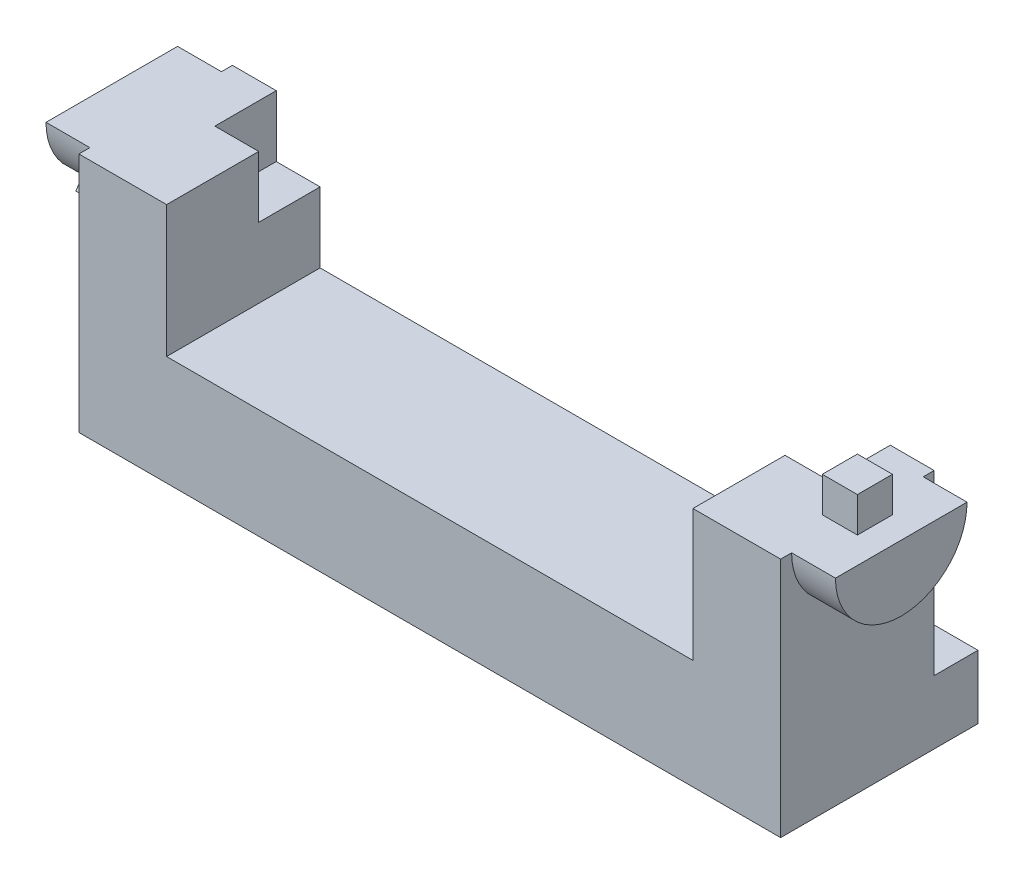
ISO-10303-21;
HEADER;
FILE_DESCRIPTION(('STEP AP214'),'2;1');
FILE_NAME('part.step','',(''),(''),'','','');
FILE_SCHEMA(('AUTOMOTIVE_DESIGN { 1 0 10303 214 1 1 1 1 }'));
ENDSEC;
DATA;
#1=APPLICATION_CONTEXT('core data for automotive mechanical design processes');
#2=APPLICATION_PROTOCOL_DEFINITION('international standard','automotive_design',2000,#1);
#3=PRODUCT_CONTEXT('',#1,'mechanical');
#4=PRODUCT('Part','Part','',(#3));
#5=PRODUCT_RELATED_PRODUCT_CATEGORY('part','',(#4));
#6=PRODUCT_DEFINITION_FORMATION('','',#4);
#7=PRODUCT_DEFINITION_CONTEXT('part definition',#1,'design');
#8=PRODUCT_DEFINITION('design','',#6,#7);
#9=PRODUCT_DEFINITION_SHAPE('','',#8);
#10=(LENGTH_UNIT() NAMED_UNIT(*) SI_UNIT(.MILLI.,.METRE.));
#11=(NAMED_UNIT(*) PLANE_ANGLE_UNIT() SI_UNIT($,.RADIAN.));
#12=(NAMED_UNIT(*) SI_UNIT($,.STERADIAN.) SOLID_ANGLE_UNIT());
#13=UNCERTAINTY_MEASURE_WITH_UNIT(LENGTH_MEASURE(1.E-05),#10,'distance_accuracy_value','');
#14=(GEOMETRIC_REPRESENTATION_CONTEXT(3) GLOBAL_UNCERTAINTY_ASSIGNED_CONTEXT((#13)) GLOBAL_UNIT_ASSIGNED_CONTEXT((#10,
#11,#12)) REPRESENTATION_CONTEXT('',''));
#15=CARTESIAN_POINT('',(0.,0.,0.));
#16=DIRECTION('',(0.,0.,1.));
#17=DIRECTION('',(1.,0.,0.));
#18=AXIS2_PLACEMENT_3D('',#15,#16,#17);
#19=CARTESIAN_POINT('',(0.,13.97,0.));
#20=DIRECTION('',(0.,1.,0.));
#21=DIRECTION('',(0.,0.,1.));
#22=AXIS2_PLACEMENT_3D('',#19,#20,#21);
#23=PLANE('',#22);
#24=DIRECTION('',(-1.,0.,0.));
#25=VECTOR('',#24,1.);
#26=CARTESIAN_POINT('',(38.1,13.97,3.556));
#27=LINE('',#26,#25);
#28=CARTESIAN_POINT('',(38.1,13.97,3.556));
#29=VERTEX_POINT('',#28);
#30=CARTESIAN_POINT('',(35.56,13.97,3.556));
#31=VERTEX_POINT('',#30);
#32=EDGE_CURVE('E385',#29,#31,#27,.T.);
#33=ORIENTED_EDGE('',*,*,#32,.T.);
#34=DIRECTION('',(0.,0.,1.));
#35=VECTOR('',#34,1.);
#36=CARTESIAN_POINT('',(35.56,13.97,8.89));
#37=LINE('',#36,#35);
#38=CARTESIAN_POINT('',(35.56,13.97,8.89));
#39=VERTEX_POINT('',#38);
#40=EDGE_CURVE('E457',#31,#39,#37,.T.);
#41=ORIENTED_EDGE('',*,*,#40,.T.);
#42=DIRECTION('',(1.,0.,0.));
#43=VECTOR('',#42,1.);
#44=CARTESIAN_POINT('',(40.64,13.97,8.89));
#45=LINE('',#44,#43);
#46=CARTESIAN_POINT('',(40.64,13.97,8.89));
#47=VERTEX_POINT('',#46);
#48=EDGE_CURVE('E459',#39,#47,#45,.T.);
#49=ORIENTED_EDGE('',*,*,#48,.T.);
#50=DIRECTION('',(0.,0.,-1.));
#51=VECTOR('',#50,1.);
#52=CARTESIAN_POINT('',(40.64,13.97,8.89));
#53=LINE('',#52,#51);
#54=CARTESIAN_POINT('',(40.64,13.97,8.255));
#55=VERTEX_POINT('',#54);
#56=EDGE_CURVE('E450',#47,#55,#53,.T.);
#57=ORIENTED_EDGE('',*,*,#56,.T.);
#58=DIRECTION('',(-1.,0.,0.));
#59=VECTOR('',#58,1.);
#60=CARTESIAN_POINT('',(43.18,13.97,8.255));
#61=LINE('',#60,#59);
#62=CARTESIAN_POINT('',(43.18,13.97,8.255));
#63=VERTEX_POINT('',#62);
#64=EDGE_CURVE('E361',#63,#55,#61,.T.);
#65=ORIENTED_EDGE('',*,*,#64,.F.);
#66=DIRECTION('',(0.,0.,1.));
#67=VECTOR('',#66,1.);
#68=CARTESIAN_POINT('',(43.18,13.97,0.635));
#69=LINE('',#68,#67);
#70=CARTESIAN_POINT('',(43.18,13.97,0.635));
#71=VERTEX_POINT('',#70);
#72=EDGE_CURVE('E359',#71,#63,#69,.T.);
#73=ORIENTED_EDGE('',*,*,#72,.F.);
#74=DIRECTION('',(-1.,0.,0.));
#75=VECTOR('',#74,1.);
#76=CARTESIAN_POINT('',(43.18,13.97,0.635));
#77=LINE('',#76,#75);
#78=CARTESIAN_POINT('',(40.64,13.97,0.635));
#79=VERTEX_POINT('',#78);
#80=EDGE_CURVE('E366',#71,#79,#77,.T.);
#81=ORIENTED_EDGE('',*,*,#80,.T.);
#82=CARTESIAN_POINT('',(40.64,13.97,0.));
#83=VERTEX_POINT('',#82);
#84=EDGE_CURVE('E454',#79,#83,#53,.T.);
#85=ORIENTED_EDGE('',*,*,#84,.T.);
#86=DIRECTION('',(-1.,0.,0.));
#87=VECTOR('',#86,1.);
#88=CARTESIAN_POINT('',(40.64,13.97,0.));
#89=LINE('',#88,#87);
#90=CARTESIAN_POINT('',(38.1,13.97,0.));
#91=VERTEX_POINT('',#90);
#92=EDGE_CURVE('E453',#83,#91,#89,.T.);
#93=ORIENTED_EDGE('',*,*,#92,.T.);
#94=DIRECTION('',(0.,0.,-1.));
#95=VECTOR('',#94,1.);
#96=CARTESIAN_POINT('',(38.1,13.97,0.));
#97=LINE('',#96,#95);
#98=EDGE_CURVE('E379',#29,#91,#97,.T.);
#99=ORIENTED_EDGE('',*,*,#98,.F.);
#100=EDGE_LOOP('',(#33,#41,#49,#57,#65,#73,#81,#85,#93,#99));
#101=FACE_BOUND('',#100,.T.);
#102=DIRECTION('',(-1.,0.,0.));
#103=VECTOR('',#102,1.);
#104=CARTESIAN_POINT('',(41.656,13.97,3.429));
#105=LINE('',#104,#103);
#106=CARTESIAN_POINT('',(41.656,13.97,3.429));
#107=VERTEX_POINT('',#106);
#108=CARTESIAN_POINT('',(39.624,13.97,3.429));
#109=VERTEX_POINT('',#108);
#110=EDGE_CURVE('E950',#107,#109,#105,.T.);
#111=ORIENTED_EDGE('',*,*,#110,.F.);
#112=DIRECTION('',(0.,0.,-1.));
#113=VECTOR('',#112,1.);
#114=CARTESIAN_POINT('',(41.656,13.97,3.429));
#115=LINE('',#114,#113);
#116=CARTESIAN_POINT('',(41.656,13.97,5.461));
#117=VERTEX_POINT('',#116);
#118=EDGE_CURVE('E285',#117,#107,#115,.T.);
#119=ORIENTED_EDGE('',*,*,#118,.F.);
#120=DIRECTION('',(1.,0.,0.));
#121=VECTOR('',#120,1.);
#122=CARTESIAN_POINT('',(41.656,13.97,5.461));
#123=LINE('',#122,#121);
#124=CARTESIAN_POINT('',(39.624,13.97,5.461));
#125=VERTEX_POINT('',#124);
#126=EDGE_CURVE('E281',#125,#117,#123,.T.);
#127=ORIENTED_EDGE('',*,*,#126,.F.);
#128=DIRECTION('',(0.,0.,1.));
#129=VECTOR('',#128,1.);
#130=CARTESIAN_POINT('',(39.624,13.97,3.429));
#131=LINE('',#130,#129);
#132=EDGE_CURVE('E947',#109,#125,#131,.T.);
#133=ORIENTED_EDGE('',*,*,#132,.F.);
#134=EDGE_LOOP('',(#111,#119,#127,#133));
#135=FACE_BOUND('',#134,.T.);
#136=ADVANCED_FACE('F51',(#101,#135),#23,.T.);
#137=CARTESIAN_POINT('',(0.,6.35,8.89));
#138=DIRECTION('',(0.,-1.,0.));
#139=DIRECTION('',(0.,0.,-1.));
#140=AXIS2_PLACEMENT_3D('',#137,#138,#139);
#141=PLANE('',#140);
#142=DIRECTION('',(0.,0.,1.));
#143=VECTOR('',#142,1.);
#144=CARTESIAN_POINT('',(35.56,6.35,8.89));
#145=LINE('',#144,#143);
#146=CARTESIAN_POINT('',(35.56,6.35,0.));
#147=VERTEX_POINT('',#146);
#148=CARTESIAN_POINT('',(35.56,6.35,8.89));
#149=VERTEX_POINT('',#148);
#150=EDGE_CURVE('E446',#147,#149,#145,.T.);
#151=ORIENTED_EDGE('',*,*,#150,.F.);
#152=DIRECTION('',(-1.,0.,0.));
#153=VECTOR('',#152,1.);
#154=CARTESIAN_POINT('',(0.,6.35,0.));
#155=LINE('',#154,#153);
#156=CARTESIAN_POINT('',(5.08,6.35,0.));
#157=VERTEX_POINT('',#156);
#158=EDGE_CURVE('E493',#147,#157,#155,.T.);
#159=ORIENTED_EDGE('',*,*,#158,.T.);
#160=DIRECTION('',(0.,0.,-1.));
#161=VECTOR('',#160,1.);
#162=CARTESIAN_POINT('',(5.08,6.35,8.89));
#163=LINE('',#162,#161);
#164=CARTESIAN_POINT('',(5.08,6.35,8.89));
#165=VERTEX_POINT('',#164);
#166=EDGE_CURVE('E469',#165,#157,#163,.T.);
#167=ORIENTED_EDGE('',*,*,#166,.F.);
#168=DIRECTION('',(-1.,0.,0.));
#169=VECTOR('',#168,1.);
#170=CARTESIAN_POINT('',(0.,6.35,8.89));
#171=LINE('',#170,#169);
#172=EDGE_CURVE('E497',#149,#165,#171,.T.);
#173=ORIENTED_EDGE('',*,*,#172,.F.);
#174=EDGE_LOOP('',(#151,#159,#167,#173));
#175=FACE_BOUND('',#174,.T.);
#176=ADVANCED_FACE('F587',(#175),#141,.F.);
#177=CARTESIAN_POINT('',(0.,0.,8.89));
#178=DIRECTION('',(1.,0.,0.));
#179=DIRECTION('',(0.,0.,-1.));
#180=AXIS2_PLACEMENT_3D('',#177,#178,#179);
#181=PLANE('',#180);
#182=CARTESIAN_POINT('',(0.,13.97,4.445));
#183=DIRECTION('',(-1.,0.,0.));
#184=DIRECTION('',(0.,0.,-1.));
#185=AXIS2_PLACEMENT_3D('',#182,#183,#184);
#186=CIRCLE('',#185,3.81);
#187=CARTESIAN_POINT('',(0.,13.97,0.635));
#188=VERTEX_POINT('',#187);
#189=CARTESIAN_POINT('',(0.,13.97,8.255));
#190=VERTEX_POINT('',#189);
#191=EDGE_CURVE('E412',#188,#190,#186,.T.);
#192=ORIENTED_EDGE('',*,*,#191,.F.);
#193=DIRECTION('',(0.,0.,1.));
#194=VECTOR('',#193,1.);
#195=CARTESIAN_POINT('',(0.,13.97,8.89));
#196=LINE('',#195,#194);
#197=CARTESIAN_POINT('',(0.,13.97,0.));
#198=VERTEX_POINT('',#197);
#199=EDGE_CURVE('E470',#198,#188,#196,.T.);
#200=ORIENTED_EDGE('',*,*,#199,.F.);
#201=DIRECTION('',(0.,-1.,0.));
#202=VECTOR('',#201,1.);
#203=CARTESIAN_POINT('',(0.,0.,0.));
#204=LINE('',#203,#202);
#205=CARTESIAN_POINT('',(0.,3.683,0.));
#206=VERTEX_POINT('',#205);
#207=EDGE_CURVE('E488',#198,#206,#204,.T.);
#208=ORIENTED_EDGE('',*,*,#207,.T.);
#209=DIRECTION('',(0.,0.,1.));
#210=VECTOR('',#209,1.);
#211=CARTESIAN_POINT('',(0.,3.683,-2.54));
#212=LINE('',#211,#210);
#213=CARTESIAN_POINT('',(0.,3.683,-2.54));
#214=VERTEX_POINT('',#213);
#215=EDGE_CURVE('E409',#214,#206,#212,.T.);
#216=ORIENTED_EDGE('',*,*,#215,.F.);
#217=DIRECTION('',(0.,1.,0.));
#218=VECTOR('',#217,1.);
#219=CARTESIAN_POINT('',(0.,0.,-2.54));
#220=LINE('',#219,#218);
#221=CARTESIAN_POINT('',(0.,0.,-2.54));
#222=VERTEX_POINT('',#221);
#223=EDGE_CURVE('E392',#222,#214,#220,.T.);
#224=ORIENTED_EDGE('',*,*,#223,.F.);
#225=DIRECTION('',(0.,0.,-1.));
#226=VECTOR('',#225,1.);
#227=CARTESIAN_POINT('',(0.,0.,8.89));
#228=LINE('',#227,#226);
#229=CARTESIAN_POINT('',(0.,0.,8.89));
#230=VERTEX_POINT('',#229);
#231=EDGE_CURVE('E12',#230,#222,#228,.T.);
#232=ORIENTED_EDGE('',*,*,#231,.F.);
#233=DIRECTION('',(0.,-1.,0.));
#234=VECTOR('',#233,1.);
#235=CARTESIAN_POINT('',(0.,0.,8.89));
#236=LINE('',#235,#234);
#237=CARTESIAN_POINT('',(0.,13.97,8.89));
#238=VERTEX_POINT('',#237);
#239=EDGE_CURVE('E489',#238,#230,#236,.T.);
#240=ORIENTED_EDGE('',*,*,#239,.F.);
#241=EDGE_CURVE('E474',#190,#238,#196,.T.);
#242=ORIENTED_EDGE('',*,*,#241,.F.);
#243=EDGE_LOOP('',(#192,#200,#208,#216,#224,#232,#240,#242));
#244=FACE_BOUND('',#243,.T.);
#245=ADVANCED_FACE('F53',(#244),#181,.F.);
#246=CARTESIAN_POINT('',(0.,0.,8.89));
#247=DIRECTION('',(0.,1.,0.));
#248=DIRECTION('',(0.,0.,1.));
#249=AXIS2_PLACEMENT_3D('',#246,#247,#248);
#250=PLANE('',#249);
#251=DIRECTION('',(-1.,0.,0.));
#252=VECTOR('',#251,1.);
#253=CARTESIAN_POINT('',(20.574,0.,3.81));
#254=LINE('',#253,#252);
#255=CARTESIAN_POINT('',(20.574,0.,3.81));
#256=VERTEX_POINT('',#255);
#257=CARTESIAN_POINT('',(20.066,0.,3.81));
#258=VERTEX_POINT('',#257);
#259=EDGE_CURVE('E290',#256,#258,#254,.T.);
#260=ORIENTED_EDGE('',*,*,#259,.F.);
#261=DIRECTION('',(0.,0.,1.));
#262=VECTOR('',#261,1.);
#263=CARTESIAN_POINT('',(20.574,0.,-2.54));
#264=LINE('',#263,#262);
#265=CARTESIAN_POINT('',(20.574,0.,-2.54));
#266=VERTEX_POINT('',#265);
#267=EDGE_CURVE('E287',#266,#256,#264,.T.);
#268=ORIENTED_EDGE('',*,*,#267,.F.);
#269=DIRECTION('',(-1.,0.,0.));
#270=VECTOR('',#269,1.);
#271=CARTESIAN_POINT('',(0.,0.,-2.54));
#272=LINE('',#271,#270);
#273=CARTESIAN_POINT('',(40.64,0.,-2.54));
#274=VERTEX_POINT('',#273);
#275=EDGE_CURVE('E401',#274,#266,#272,.T.);
#276=ORIENTED_EDGE('',*,*,#275,.F.);
#277=DIRECTION('',(0.,0.,-1.));
#278=VECTOR('',#277,1.);
#279=CARTESIAN_POINT('',(40.64,0.,8.89));
#280=LINE('',#279,#278);
#281=CARTESIAN_POINT('',(40.64,0.,8.89));
#282=VERTEX_POINT('',#281);
#283=EDGE_CURVE('E59',#282,#274,#280,.T.);
#284=ORIENTED_EDGE('',*,*,#283,.F.);
#285=DIRECTION('',(1.,0.,0.));
#286=VECTOR('',#285,1.);
#287=CARTESIAN_POINT('',(0.,0.,8.89));
#288=LINE('',#287,#286);
#289=EDGE_CURVE('E492',#230,#282,#288,.T.);
#290=ORIENTED_EDGE('',*,*,#289,.F.);
#291=ORIENTED_EDGE('',*,*,#231,.T.);
#292=CARTESIAN_POINT('',(20.066,0.,-2.54));
#293=VERTEX_POINT('',#292);
#294=EDGE_CURVE('E400',#293,#222,#272,.T.);
#295=ORIENTED_EDGE('',*,*,#294,.F.);
#296=DIRECTION('',(0.,0.,-1.));
#297=VECTOR('',#296,1.);
#298=CARTESIAN_POINT('',(20.066,0.,-2.54));
#299=LINE('',#298,#297);
#300=EDGE_CURVE('E299',#258,#293,#299,.T.);
#301=ORIENTED_EDGE('',*,*,#300,.F.);
#302=EDGE_LOOP('',(#260,#268,#276,#284,#290,#291,#295,#301));
#303=FACE_BOUND('',#302,.T.);
#304=ADVANCED_FACE('F519',(#303),#250,.F.);
#305=CARTESIAN_POINT('',(40.64,0.,8.89));
#306=DIRECTION('',(-1.,0.,0.));
#307=DIRECTION('',(0.,0.,1.));
#308=AXIS2_PLACEMENT_3D('',#305,#306,#307);
#309=PLANE('',#308);
#310=CARTESIAN_POINT('',(40.64,13.97,4.445));
#311=DIRECTION('',(1.,0.,0.));
#312=DIRECTION('',(0.,0.,-1.));
#313=AXIS2_PLACEMENT_3D('',#310,#311,#312);
#314=CIRCLE('',#313,3.81);
#315=EDGE_CURVE('E354',#55,#79,#314,.T.);
#316=ORIENTED_EDGE('',*,*,#315,.F.);
#317=ORIENTED_EDGE('',*,*,#56,.F.);
#318=DIRECTION('',(0.,1.,0.));
#319=VECTOR('',#318,1.);
#320=CARTESIAN_POINT('',(40.64,0.,8.89));
#321=LINE('',#320,#319);
#322=EDGE_CURVE('E495',#282,#47,#321,.T.);
#323=ORIENTED_EDGE('',*,*,#322,.F.);
#324=ORIENTED_EDGE('',*,*,#283,.T.);
#325=DIRECTION('',(0.,-1.,0.));
#326=VECTOR('',#325,1.);
#327=CARTESIAN_POINT('',(40.64,0.,-2.54));
#328=LINE('',#327,#326);
#329=CARTESIAN_POINT('',(40.64,3.683,-2.54));
#330=VERTEX_POINT('',#329);
#331=EDGE_CURVE('E397',#330,#274,#328,.T.);
#332=ORIENTED_EDGE('',*,*,#331,.F.);
#333=DIRECTION('',(0.,0.,1.));
#334=VECTOR('',#333,1.);
#335=CARTESIAN_POINT('',(40.64,3.683,-2.54));
#336=LINE('',#335,#334);
#337=CARTESIAN_POINT('',(40.64,3.683,0.));
#338=VERTEX_POINT('',#337);
#339=EDGE_CURVE('E404',#330,#338,#336,.T.);
#340=ORIENTED_EDGE('',*,*,#339,.T.);
#341=DIRECTION('',(0.,1.,0.));
#342=VECTOR('',#341,1.);
#343=CARTESIAN_POINT('',(40.64,0.,0.));
#344=LINE('',#343,#342);
#345=EDGE_CURVE('E501',#338,#83,#344,.T.);
#346=ORIENTED_EDGE('',*,*,#345,.T.);
#347=ORIENTED_EDGE('',*,*,#84,.F.);
#348=EDGE_LOOP('',(#316,#317,#323,#324,#332,#340,#346,#347));
#349=FACE_BOUND('',#348,.T.);
#350=ADVANCED_FACE('F509',(#349),#309,.F.);
#351=CARTESIAN_POINT('',(0.,0.,8.89));
#352=DIRECTION('',(0.,0.,-1.));
#353=DIRECTION('',(-1.,0.,0.));
#354=AXIS2_PLACEMENT_3D('',#351,#352,#353);
#355=PLANE('',#354);
#356=ORIENTED_EDGE('',*,*,#239,.T.);
#357=ORIENTED_EDGE('',*,*,#289,.T.);
#358=ORIENTED_EDGE('',*,*,#322,.T.);
#359=ORIENTED_EDGE('',*,*,#48,.F.);
#360=DIRECTION('',(0.,-1.,0.));
#361=VECTOR('',#360,1.);
#362=CARTESIAN_POINT('',(35.56,13.97,8.89));
#363=LINE('',#362,#361);
#364=EDGE_CURVE('E462',#39,#149,#363,.T.);
#365=ORIENTED_EDGE('',*,*,#364,.T.);
#366=ORIENTED_EDGE('',*,*,#172,.T.);
#367=DIRECTION('',(0.,-1.,0.));
#368=VECTOR('',#367,1.);
#369=CARTESIAN_POINT('',(5.08,13.97,8.89));
#370=LINE('',#369,#368);
#371=CARTESIAN_POINT('',(5.08,13.97,8.89));
#372=VERTEX_POINT('',#371);
#373=EDGE_CURVE('E485',#372,#165,#370,.T.);
#374=ORIENTED_EDGE('',*,*,#373,.F.);
#375=DIRECTION('',(1.,0.,0.));
#376=VECTOR('',#375,1.);
#377=CARTESIAN_POINT('',(0.,13.97,8.89));
#378=LINE('',#377,#376);
#379=EDGE_CURVE('E473',#238,#372,#378,.T.);
#380=ORIENTED_EDGE('',*,*,#379,.F.);
#381=EDGE_LOOP('',(#356,#357,#358,#359,#365,#366,#374,#380));
#382=FACE_BOUND('',#381,.T.);
#383=ADVANCED_FACE('F556',(#382),#355,.F.);
#384=CARTESIAN_POINT('',(0.,0.,0.));
#385=DIRECTION('',(0.,0.,-1.));
#386=DIRECTION('',(-1.,0.,0.));
#387=AXIS2_PLACEMENT_3D('',#384,#385,#386);
#388=PLANE('',#387);
#389=DIRECTION('',(-1.,0.,0.));
#390=VECTOR('',#389,1.);
#391=CARTESIAN_POINT('',(38.1,9.398,0.));
#392=LINE('',#391,#390);
#393=CARTESIAN_POINT('',(38.1,9.398,0.));
#394=VERTEX_POINT('',#393);
#395=CARTESIAN_POINT('',(35.56,9.398,0.));
#396=VERTEX_POINT('',#395);
#397=EDGE_CURVE('E381',#394,#396,#392,.T.);
#398=ORIENTED_EDGE('',*,*,#397,.F.);
#399=DIRECTION('',(0.,-1.,0.));
#400=VECTOR('',#399,1.);
#401=CARTESIAN_POINT('',(38.1,13.97,0.));
#402=LINE('',#401,#400);
#403=EDGE_CURVE('E370',#91,#394,#402,.T.);
#404=ORIENTED_EDGE('',*,*,#403,.F.);
#405=ORIENTED_EDGE('',*,*,#92,.F.);
#406=ORIENTED_EDGE('',*,*,#345,.F.);
#407=DIRECTION('',(1.,0.,0.));
#408=VECTOR('',#407,1.);
#409=CARTESIAN_POINT('',(0.,3.683,0.));
#410=LINE('',#409,#408);
#411=EDGE_CURVE('E388',#206,#338,#410,.T.);
#412=ORIENTED_EDGE('',*,*,#411,.F.);
#413=ORIENTED_EDGE('',*,*,#207,.F.);
#414=DIRECTION('',(-1.,0.,0.));
#415=VECTOR('',#414,1.);
#416=CARTESIAN_POINT('',(0.,13.97,0.));
#417=LINE('',#416,#415);
#418=CARTESIAN_POINT('',(2.54,13.97,0.));
#419=VERTEX_POINT('',#418);
#420=EDGE_CURVE('E479',#419,#198,#417,.T.);
#421=ORIENTED_EDGE('',*,*,#420,.F.);
#422=DIRECTION('',(0.,1.,0.));
#423=VECTOR('',#422,1.);
#424=CARTESIAN_POINT('',(2.54,13.97,0.));
#425=LINE('',#424,#423);
#426=CARTESIAN_POINT('',(2.54,10.414,0.));
#427=VERTEX_POINT('',#426);
#428=EDGE_CURVE('E427',#427,#419,#425,.T.);
#429=ORIENTED_EDGE('',*,*,#428,.F.);
#430=DIRECTION('',(1.,0.,0.));
#431=VECTOR('',#430,1.);
#432=CARTESIAN_POINT('',(2.54,10.414,0.));
#433=LINE('',#432,#431);
#434=CARTESIAN_POINT('',(5.08,10.414,0.));
#435=VERTEX_POINT('',#434);
#436=EDGE_CURVE('E443',#427,#435,#433,.T.);
#437=ORIENTED_EDGE('',*,*,#436,.T.);
#438=DIRECTION('',(0.,-1.,0.));
#439=VECTOR('',#438,1.);
#440=CARTESIAN_POINT('',(5.08,13.97,0.));
#441=LINE('',#440,#439);
#442=EDGE_CURVE('E481',#435,#157,#441,.T.);
#443=ORIENTED_EDGE('',*,*,#442,.T.);
#444=ORIENTED_EDGE('',*,*,#158,.F.);
#445=DIRECTION('',(0.,-1.,0.));
#446=VECTOR('',#445,1.);
#447=CARTESIAN_POINT('',(35.56,13.97,0.));
#448=LINE('',#447,#446);
#449=EDGE_CURVE('E467',#396,#147,#448,.T.);
#450=ORIENTED_EDGE('',*,*,#449,.F.);
#451=EDGE_LOOP('',(#398,#404,#405,#406,#412,#413,#421,#429,#437,#443,#444,#450));
#452=FACE_BOUND('',#451,.T.);
#453=ADVANCED_FACE('F543',(#452),#388,.T.);
#454=CARTESIAN_POINT('',(5.08,13.97,8.89));
#455=DIRECTION('',(-1.,0.,0.));
#456=DIRECTION('',(0.,0.,1.));
#457=AXIS2_PLACEMENT_3D('',#454,#455,#456);
#458=PLANE('',#457);
#459=ORIENTED_EDGE('',*,*,#442,.F.);
#460=DIRECTION('',(0.,0.,-1.));
#461=VECTOR('',#460,1.);
#462=CARTESIAN_POINT('',(5.08,10.414,0.));
#463=LINE('',#462,#461);
#464=CARTESIAN_POINT('',(5.08,10.414,3.556));
#465=VERTEX_POINT('',#464);
#466=EDGE_CURVE('E430',#465,#435,#463,.T.);
#467=ORIENTED_EDGE('',*,*,#466,.F.);
#468=DIRECTION('',(0.,-1.,0.));
#469=VECTOR('',#468,1.);
#470=CARTESIAN_POINT('',(5.08,13.97,3.556));
#471=LINE('',#470,#469);
#472=CARTESIAN_POINT('',(5.08,13.97,3.556));
#473=VERTEX_POINT('',#472);
#474=EDGE_CURVE('E426',#473,#465,#471,.T.);
#475=ORIENTED_EDGE('',*,*,#474,.F.);
#476=DIRECTION('',(0.,0.,-1.));
#477=VECTOR('',#476,1.);
#478=CARTESIAN_POINT('',(5.08,13.97,8.89));
#479=LINE('',#478,#477);
#480=EDGE_CURVE('E476',#372,#473,#479,.T.);
#481=ORIENTED_EDGE('',*,*,#480,.F.);
#482=ORIENTED_EDGE('',*,*,#373,.T.);
#483=ORIENTED_EDGE('',*,*,#166,.T.);
#484=EDGE_LOOP('',(#459,#467,#475,#481,#482,#483));
#485=FACE_BOUND('',#484,.T.);
#486=ADVANCED_FACE('F580',(#485),#458,.F.);
#487=CARTESIAN_POINT('',(0.,13.97,0.));
#488=DIRECTION('',(0.,-1.,0.));
#489=DIRECTION('',(0.,0.,-1.));
#490=AXIS2_PLACEMENT_3D('',#487,#488,#489);
#491=PLANE('',#490);
#492=ORIENTED_EDGE('',*,*,#480,.T.);
#493=DIRECTION('',(1.,0.,0.));
#494=VECTOR('',#493,1.);
#495=CARTESIAN_POINT('',(2.54,13.97,3.556));
#496=LINE('',#495,#494);
#497=CARTESIAN_POINT('',(2.54,13.97,3.556));
#498=VERTEX_POINT('',#497);
#499=EDGE_CURVE('E439',#498,#473,#496,.T.);
#500=ORIENTED_EDGE('',*,*,#499,.F.);
#501=DIRECTION('',(0.,0.,1.));
#502=VECTOR('',#501,1.);
#503=CARTESIAN_POINT('',(2.54,13.97,0.));
#504=LINE('',#503,#502);
#505=EDGE_CURVE('E429',#419,#498,#504,.T.);
#506=ORIENTED_EDGE('',*,*,#505,.F.);
#507=ORIENTED_EDGE('',*,*,#420,.T.);
#508=ORIENTED_EDGE('',*,*,#199,.T.);
#509=DIRECTION('',(1.,0.,0.));
#510=VECTOR('',#509,1.);
#511=CARTESIAN_POINT('',(-2.54,13.97,0.635));
#512=LINE('',#511,#510);
#513=CARTESIAN_POINT('',(-2.54,13.97,0.635));
#514=VERTEX_POINT('',#513);
#515=EDGE_CURVE('E418',#514,#188,#512,.T.);
#516=ORIENTED_EDGE('',*,*,#515,.F.);
#517=DIRECTION('',(0.,0.,-1.));
#518=VECTOR('',#517,1.);
#519=CARTESIAN_POINT('',(-2.54,13.97,8.255));
#520=LINE('',#519,#518);
#521=CARTESIAN_POINT('',(-2.54,13.97,8.255));
#522=VERTEX_POINT('',#521);
#523=EDGE_CURVE('E416',#522,#514,#520,.T.);
#524=ORIENTED_EDGE('',*,*,#523,.F.);
#525=DIRECTION('',(1.,0.,0.));
#526=VECTOR('',#525,1.);
#527=CARTESIAN_POINT('',(-2.54,13.97,8.255));
#528=LINE('',#527,#526);
#529=EDGE_CURVE('E423',#522,#190,#528,.T.);
#530=ORIENTED_EDGE('',*,*,#529,.T.);
#531=ORIENTED_EDGE('',*,*,#241,.T.);
#532=ORIENTED_EDGE('',*,*,#379,.T.);
#533=EDGE_LOOP('',(#492,#500,#506,#507,#508,#516,#524,#530,#531,#532));
#534=FACE_BOUND('',#533,.T.);
#535=ADVANCED_FACE('F562',(#534),#491,.F.);
#536=CARTESIAN_POINT('',(35.56,13.97,8.89));
#537=DIRECTION('',(1.,0.,0.));
#538=DIRECTION('',(0.,0.,-1.));
#539=AXIS2_PLACEMENT_3D('',#536,#537,#538);
#540=PLANE('',#539);
#541=ORIENTED_EDGE('',*,*,#40,.F.);
#542=DIRECTION('',(0.,1.,0.));
#543=VECTOR('',#542,1.);
#544=CARTESIAN_POINT('',(35.56,13.97,3.556));
#545=LINE('',#544,#543);
#546=CARTESIAN_POINT('',(35.56,9.398,3.556));
#547=VERTEX_POINT('',#546);
#548=EDGE_CURVE('E374',#547,#31,#545,.T.);
#549=ORIENTED_EDGE('',*,*,#548,.F.);
#550=DIRECTION('',(0.,0.,1.));
#551=VECTOR('',#550,1.);
#552=CARTESIAN_POINT('',(35.56,9.398,0.));
#553=LINE('',#552,#551);
#554=EDGE_CURVE('E369',#396,#547,#553,.T.);
#555=ORIENTED_EDGE('',*,*,#554,.F.);
#556=ORIENTED_EDGE('',*,*,#449,.T.);
#557=ORIENTED_EDGE('',*,*,#150,.T.);
#558=ORIENTED_EDGE('',*,*,#364,.F.);
#559=EDGE_LOOP('',(#541,#549,#555,#556,#557,#558));
#560=FACE_BOUND('',#559,.T.);
#561=ADVANCED_FACE('F589',(#560),#540,.F.);
#562=CARTESIAN_POINT('',(2.54,10.414,0.));
#563=DIRECTION('',(0.,-1.,0.));
#564=DIRECTION('',(0.,0.,-1.));
#565=AXIS2_PLACEMENT_3D('',#562,#563,#564);
#566=PLANE('',#565);
#567=ORIENTED_EDGE('',*,*,#466,.T.);
#568=ORIENTED_EDGE('',*,*,#436,.F.);
#569=DIRECTION('',(0.,0.,-1.));
#570=VECTOR('',#569,1.);
#571=CARTESIAN_POINT('',(2.54,10.414,0.));
#572=LINE('',#571,#570);
#573=CARTESIAN_POINT('',(2.54,10.414,3.556));
#574=VERTEX_POINT('',#573);
#575=EDGE_CURVE('E436',#574,#427,#572,.T.);
#576=ORIENTED_EDGE('',*,*,#575,.F.);
#577=DIRECTION('',(1.,0.,0.));
#578=VECTOR('',#577,1.);
#579=CARTESIAN_POINT('',(2.54,10.414,3.556));
#580=LINE('',#579,#578);
#581=EDGE_CURVE('E447',#574,#465,#580,.T.);
#582=ORIENTED_EDGE('',*,*,#581,.T.);
#583=EDGE_LOOP('',(#567,#568,#576,#582));
#584=FACE_BOUND('',#583,.T.);
#585=ADVANCED_FACE('F576',(#584),#566,.F.);
#586=CARTESIAN_POINT('',(2.54,13.97,3.556));
#587=DIRECTION('',(0.,0.,1.));
#588=DIRECTION('',(0.,-1.,0.));
#589=AXIS2_PLACEMENT_3D('',#586,#587,#588);
#590=PLANE('',#589);
#591=ORIENTED_EDGE('',*,*,#474,.T.);
#592=ORIENTED_EDGE('',*,*,#581,.F.);
#593=DIRECTION('',(0.,-1.,0.));
#594=VECTOR('',#593,1.);
#595=CARTESIAN_POINT('',(2.54,13.97,3.556));
#596=LINE('',#595,#594);
#597=EDGE_CURVE('E433',#498,#574,#596,.T.);
#598=ORIENTED_EDGE('',*,*,#597,.F.);
#599=ORIENTED_EDGE('',*,*,#499,.T.);
#600=EDGE_LOOP('',(#591,#592,#598,#599));
#601=FACE_BOUND('',#600,.T.);
#602=ADVANCED_FACE('F617',(#601),#590,.F.);
#603=CARTESIAN_POINT('',(2.54,0.,0.));
#604=DIRECTION('',(-1.,0.,0.));
#605=DIRECTION('',(0.,0.,1.));
#606=AXIS2_PLACEMENT_3D('',#603,#604,#605);
#607=PLANE('',#606);
#608=ORIENTED_EDGE('',*,*,#428,.T.);
#609=ORIENTED_EDGE('',*,*,#505,.T.);
#610=ORIENTED_EDGE('',*,*,#597,.T.);
#611=ORIENTED_EDGE('',*,*,#575,.T.);
#612=EDGE_LOOP('',(#608,#609,#610,#611));
#613=FACE_BOUND('',#612,.T.);
#614=ADVANCED_FACE('F573',(#613),#607,.F.);
#615=CARTESIAN_POINT('',(-2.54,13.97,4.445));
#616=DIRECTION('',(1.,0.,0.));
#617=DIRECTION('',(0.,0.,-1.));
#618=AXIS2_PLACEMENT_3D('',#615,#616,#617);
#619=CYLINDRICAL_SURFACE('',#618,3.81);
#620=DIRECTION('',(1.,0.,0.));
#621=VECTOR('',#620,1.);
#622=CARTESIAN_POINT('',(-1.905,10.9095763125739,6.71434062085028));
#623=LINE('',#622,#621);
#624=CARTESIAN_POINT('',(-1.905,10.9095763125739,6.71434062085028));
#625=VERTEX_POINT('',#624);
#626=CARTESIAN_POINT('',(-0.888999999999999,10.9095763125739,6.71434062085028));
#627=VERTEX_POINT('',#626);
#628=EDGE_CURVE('E322',#625,#627,#623,.T.);
#629=ORIENTED_EDGE('',*,*,#628,.T.);
#630=CARTESIAN_POINT('',(-0.888999999999999,13.97,4.445));
#631=DIRECTION('',(1.,0.,0.));
#632=DIRECTION('',(0.,-0.767870026776075,-0.640605668082098));
#633=AXIS2_PLACEMENT_3D('',#630,#631,#632);
#634=CIRCLE('',#633,3.81);
#635=CARTESIAN_POINT('',(-0.889,11.0444151979832,2.00429240460721));
#636=VERTEX_POINT('',#635);
#637=EDGE_CURVE('E339',#627,#636,#634,.T.);
#638=ORIENTED_EDGE('',*,*,#637,.T.);
#639=DIRECTION('',(-1.,0.,0.));
#640=VECTOR('',#639,1.);
#641=CARTESIAN_POINT('',(-0.889,11.0444151979832,2.00429240460721));
#642=LINE('',#641,#640);
#643=CARTESIAN_POINT('',(-1.905,11.0444151979832,2.00429240460721));
#644=VERTEX_POINT('',#643);
#645=EDGE_CURVE('E335',#636,#644,#642,.T.);
#646=ORIENTED_EDGE('',*,*,#645,.T.);
#647=CARTESIAN_POINT('',(-1.905,13.97,4.445));
#648=DIRECTION('',(1.,0.,0.));
#649=DIRECTION('',(0.,-0.767870026776075,-0.640605668082098));
#650=AXIS2_PLACEMENT_3D('',#647,#648,#649);
#651=CIRCLE('',#650,3.81);
#652=EDGE_CURVE('E310',#625,#644,#651,.T.);
#653=ORIENTED_EDGE('',*,*,#652,.F.);
#654=EDGE_LOOP('',(#629,#638,#646,#653));
#655=FACE_BOUND('',#654,.T.);
#656=ORIENTED_EDGE('',*,*,#191,.T.);
#657=ORIENTED_EDGE('',*,*,#529,.F.);
#658=CARTESIAN_POINT('',(-2.54,13.97,4.445));
#659=DIRECTION('',(-1.,0.,0.));
#660=DIRECTION('',(0.,0.,-1.));
#661=AXIS2_PLACEMENT_3D('',#658,#659,#660);
#662=CIRCLE('',#661,3.81);
#663=EDGE_CURVE('E413',#514,#522,#662,.T.);
#664=ORIENTED_EDGE('',*,*,#663,.F.);
#665=ORIENTED_EDGE('',*,*,#515,.T.);
#666=EDGE_LOOP('',(#656,#657,#664,#665));
#667=FACE_BOUND('',#666,.T.);
#668=ADVANCED_FACE('F566',(#655,#667),#619,.T.);
#669=CARTESIAN_POINT('',(-2.54,13.97,4.445));
#670=DIRECTION('',(1.,0.,0.));
#671=DIRECTION('',(0.,0.,-1.));
#672=AXIS2_PLACEMENT_3D('',#669,#670,#671);
#673=PLANE('',#672);
#674=ORIENTED_EDGE('',*,*,#663,.T.);
#675=ORIENTED_EDGE('',*,*,#523,.T.);
#676=EDGE_LOOP('',(#674,#675));
#677=FACE_BOUND('',#676,.T.);
#678=ADVANCED_FACE('F695',(#677),#673,.F.);
#679=CARTESIAN_POINT('',(0.,3.683,-2.54));
#680=DIRECTION('',(0.,-1.,0.));
#681=DIRECTION('',(0.,0.,-1.));
#682=AXIS2_PLACEMENT_3D('',#679,#680,#681);
#683=PLANE('',#682);
#684=ORIENTED_EDGE('',*,*,#411,.T.);
#685=ORIENTED_EDGE('',*,*,#339,.F.);
#686=DIRECTION('',(1.,0.,0.));
#687=VECTOR('',#686,1.);
#688=CARTESIAN_POINT('',(0.,3.683,-2.54));
#689=LINE('',#688,#687);
#690=EDGE_CURVE('E395',#214,#330,#689,.T.);
#691=ORIENTED_EDGE('',*,*,#690,.F.);
#692=ORIENTED_EDGE('',*,*,#215,.T.);
#693=EDGE_LOOP('',(#684,#685,#691,#692));
#694=FACE_BOUND('',#693,.T.);
#695=ADVANCED_FACE('F538',(#694),#683,.F.);
#696=CARTESIAN_POINT('',(0.,0.,-2.54));
#697=DIRECTION('',(0.,0.,-1.));
#698=DIRECTION('',(-1.,0.,0.));
#699=AXIS2_PLACEMENT_3D('',#696,#697,#698);
#700=PLANE('',#699);
#701=DIRECTION('',(0.,-1.,0.));
#702=VECTOR('',#701,1.);
#703=CARTESIAN_POINT('',(20.574,1.27,-2.54));
#704=LINE('',#703,#702);
#705=CARTESIAN_POINT('',(20.574,1.27,-2.54));
#706=VERTEX_POINT('',#705);
#707=EDGE_CURVE('E308',#706,#266,#704,.T.);
#708=ORIENTED_EDGE('',*,*,#707,.F.);
#709=DIRECTION('',(1.,0.,0.));
#710=VECTOR('',#709,1.);
#711=CARTESIAN_POINT('',(20.574,1.27,-2.54));
#712=LINE('',#711,#710);
#713=CARTESIAN_POINT('',(20.066,1.27,-2.54));
#714=VERTEX_POINT('',#713);
#715=EDGE_CURVE('E302',#714,#706,#712,.T.);
#716=ORIENTED_EDGE('',*,*,#715,.F.);
#717=DIRECTION('',(0.,-1.,0.));
#718=VECTOR('',#717,1.);
#719=CARTESIAN_POINT('',(20.066,1.27,-2.54));
#720=LINE('',#719,#718);
#721=EDGE_CURVE('E311',#714,#293,#720,.T.);
#722=ORIENTED_EDGE('',*,*,#721,.T.);
#723=ORIENTED_EDGE('',*,*,#294,.T.);
#724=ORIENTED_EDGE('',*,*,#223,.T.);
#725=ORIENTED_EDGE('',*,*,#690,.T.);
#726=ORIENTED_EDGE('',*,*,#331,.T.);
#727=ORIENTED_EDGE('',*,*,#275,.T.);
#728=EDGE_LOOP('',(#708,#716,#722,#723,#724,#725,#726,#727));
#729=FACE_BOUND('',#728,.T.);
#730=ADVANCED_FACE('F515',(#729),#700,.T.);
#731=CARTESIAN_POINT('',(38.1,13.97,3.556));
#732=DIRECTION('',(0.,0.,1.));
#733=DIRECTION('',(0.,-1.,0.));
#734=AXIS2_PLACEMENT_3D('',#731,#732,#733);
#735=PLANE('',#734);
#736=ORIENTED_EDGE('',*,*,#548,.T.);
#737=ORIENTED_EDGE('',*,*,#32,.F.);
#738=DIRECTION('',(0.,1.,0.));
#739=VECTOR('',#738,1.);
#740=CARTESIAN_POINT('',(38.1,13.97,3.556));
#741=LINE('',#740,#739);
#742=CARTESIAN_POINT('',(38.1,9.398,3.556));
#743=VERTEX_POINT('',#742);
#744=EDGE_CURVE('E377',#743,#29,#741,.T.);
#745=ORIENTED_EDGE('',*,*,#744,.F.);
#746=DIRECTION('',(-1.,0.,0.));
#747=VECTOR('',#746,1.);
#748=CARTESIAN_POINT('',(38.1,9.398,3.556));
#749=LINE('',#748,#747);
#750=EDGE_CURVE('E389',#743,#547,#749,.T.);
#751=ORIENTED_EDGE('',*,*,#750,.T.);
#752=EDGE_LOOP('',(#736,#737,#745,#751));
#753=FACE_BOUND('',#752,.T.);
#754=ADVANCED_FACE('F599',(#753),#735,.F.);
#755=CARTESIAN_POINT('',(38.1,9.398,0.));
#756=DIRECTION('',(0.,-1.,0.));
#757=DIRECTION('',(0.,0.,-1.));
#758=AXIS2_PLACEMENT_3D('',#755,#756,#757);
#759=PLANE('',#758);
#760=ORIENTED_EDGE('',*,*,#554,.T.);
#761=ORIENTED_EDGE('',*,*,#750,.F.);
#762=DIRECTION('',(0.,0.,1.));
#763=VECTOR('',#762,1.);
#764=CARTESIAN_POINT('',(38.1,9.398,0.));
#765=LINE('',#764,#763);
#766=EDGE_CURVE('E373',#394,#743,#765,.T.);
#767=ORIENTED_EDGE('',*,*,#766,.F.);
#768=ORIENTED_EDGE('',*,*,#397,.T.);
#769=EDGE_LOOP('',(#760,#761,#767,#768));
#770=FACE_BOUND('',#769,.T.);
#771=ADVANCED_FACE('F593',(#770),#759,.F.);
#772=CARTESIAN_POINT('',(38.1,0.,0.));
#773=DIRECTION('',(-1.,0.,0.));
#774=DIRECTION('',(0.,0.,1.));
#775=AXIS2_PLACEMENT_3D('',#772,#773,#774);
#776=PLANE('',#775);
#777=ORIENTED_EDGE('',*,*,#403,.T.);
#778=ORIENTED_EDGE('',*,*,#766,.T.);
#779=ORIENTED_EDGE('',*,*,#744,.T.);
#780=ORIENTED_EDGE('',*,*,#98,.T.);
#781=EDGE_LOOP('',(#777,#778,#779,#780));
#782=FACE_BOUND('',#781,.T.);
#783=ADVANCED_FACE('F596',(#782),#776,.T.);
#784=CARTESIAN_POINT('',(43.18,13.97,4.445));
#785=DIRECTION('',(-1.,0.,0.));
#786=DIRECTION('',(0.,0.,1.));
#787=AXIS2_PLACEMENT_3D('',#784,#785,#786);
#788=CYLINDRICAL_SURFACE('',#787,3.81);
#789=ORIENTED_EDGE('',*,*,#315,.T.);
#790=ORIENTED_EDGE('',*,*,#80,.F.);
#791=CARTESIAN_POINT('',(43.18,13.97,4.445));
#792=DIRECTION('',(1.,0.,0.));
#793=DIRECTION('',(0.,0.,-1.));
#794=AXIS2_PLACEMENT_3D('',#791,#792,#793);
#795=CIRCLE('',#794,3.81);
#796=EDGE_CURVE('E356',#63,#71,#795,.T.);
#797=ORIENTED_EDGE('',*,*,#796,.F.);
#798=ORIENTED_EDGE('',*,*,#64,.T.);
#799=EDGE_LOOP('',(#789,#790,#797,#798));
#800=FACE_BOUND('',#799,.T.);
#801=ADVANCED_FACE('F551',(#800),#788,.T.);
#802=CARTESIAN_POINT('',(43.18,13.97,4.445));
#803=DIRECTION('',(1.,0.,0.));
#804=DIRECTION('',(0.,0.,-1.));
#805=AXIS2_PLACEMENT_3D('',#802,#803,#804);
#806=PLANE('',#805);
#807=ORIENTED_EDGE('',*,*,#796,.T.);
#808=ORIENTED_EDGE('',*,*,#72,.T.);
#809=EDGE_LOOP('',(#807,#808));
#810=FACE_BOUND('',#809,.T.);
#811=ADVANCED_FACE('F820',(#810),#806,.T.);
#812=CARTESIAN_POINT('',(-0.888999999999999,13.97,4.445));
#813=DIRECTION('',(-1.,0.,0.));
#814=DIRECTION('',(0.,0.,1.));
#815=AXIS2_PLACEMENT_3D('',#812,#813,#814);
#816=PLANE('',#815);
#817=DIRECTION('',(0.,-0.767870026776075,-0.640605668082098));
#818=VECTOR('',#817,1.);
#819=CARTESIAN_POINT('',(-0.889,11.0444151979832,2.00429240460721));
#820=LINE('',#819,#818);
#821=CARTESIAN_POINT('',(-0.889,10.4592982375798,1.51615088552865));
#822=VERTEX_POINT('',#821);
#823=EDGE_CURVE('E352',#636,#822,#820,.T.);
#824=ORIENTED_EDGE('',*,*,#823,.F.);
#825=ORIENTED_EDGE('',*,*,#637,.F.);
#826=DIRECTION('',(0.,-0.803260810348062,0.595627459540756));
#827=VECTOR('',#826,1.);
#828=CARTESIAN_POINT('',(-0.888999999999999,10.9095763125739,6.71434062085028));
#829=LINE('',#828,#827);
#830=CARTESIAN_POINT('',(-0.889,10.2974915750887,7.16820874502034));
#831=VERTEX_POINT('',#830);
#832=EDGE_CURVE('E350',#627,#831,#829,.T.);
#833=ORIENTED_EDGE('',*,*,#832,.T.);
#834=CARTESIAN_POINT('',(-0.889,13.97,4.445));
#835=DIRECTION('',(1.,0.,0.));
#836=DIRECTION('',(0.,0.,-1.));
#837=AXIS2_PLACEMENT_3D('',#834,#835,#836);
#838=CIRCLE('',#837,4.572);
#839=EDGE_CURVE('E328',#831,#822,#838,.T.);
#840=ORIENTED_EDGE('',*,*,#839,.T.);
#841=EDGE_LOOP('',(#824,#825,#833,#840));
#842=FACE_BOUND('',#841,.T.);
#843=ADVANCED_FACE('F816',(#842),#816,.F.);
#844=CARTESIAN_POINT('',(-1.397,10.9095763125739,6.71434062085028));
#845=DIRECTION('',(0.,-0.595627459540756,-0.803260810348062));
#846=DIRECTION('',(1.,0.,0.));
#847=AXIS2_PLACEMENT_3D('',#844,#845,#846);
#848=PLANE('',#847);
#849=ORIENTED_EDGE('',*,*,#832,.F.);
#850=ORIENTED_EDGE('',*,*,#628,.F.);
#851=DIRECTION('',(0.,-0.803260810348062,0.595627459540756));
#852=VECTOR('',#851,1.);
#853=CARTESIAN_POINT('',(-1.905,10.9095763125739,6.71434062085028));
#854=LINE('',#853,#852);
#855=CARTESIAN_POINT('',(-1.905,10.2974915750887,7.16820874502034));
#856=VERTEX_POINT('',#855);
#857=EDGE_CURVE('E348',#625,#856,#854,.T.);
#858=ORIENTED_EDGE('',*,*,#857,.T.);
#859=DIRECTION('',(1.,0.,0.));
#860=VECTOR('',#859,1.);
#861=CARTESIAN_POINT('',(-2.54,10.2974915750887,7.16820874502034));
#862=LINE('',#861,#860);
#863=EDGE_CURVE('E323',#856,#831,#862,.T.);
#864=ORIENTED_EDGE('',*,*,#863,.T.);
#865=EDGE_LOOP('',(#849,#850,#858,#864));
#866=FACE_BOUND('',#865,.T.);
#867=ADVANCED_FACE('F812',(#866),#848,.F.);
#868=CARTESIAN_POINT('',(-1.905,13.97,4.445));
#869=DIRECTION('',(-1.,0.,0.));
#870=DIRECTION('',(0.,0.,1.));
#871=AXIS2_PLACEMENT_3D('',#868,#869,#870);
#872=PLANE('',#871);
#873=ORIENTED_EDGE('',*,*,#857,.F.);
#874=ORIENTED_EDGE('',*,*,#652,.T.);
#875=DIRECTION('',(0.,-0.767870026776075,-0.640605668082098));
#876=VECTOR('',#875,1.);
#877=CARTESIAN_POINT('',(-1.905,11.0444151979832,2.00429240460721));
#878=LINE('',#877,#876);
#879=CARTESIAN_POINT('',(-1.905,10.4592982375798,1.51615088552865));
#880=VERTEX_POINT('',#879);
#881=EDGE_CURVE('E327',#644,#880,#878,.T.);
#882=ORIENTED_EDGE('',*,*,#881,.T.);
#883=CARTESIAN_POINT('',(-1.905,13.97,4.445));
#884=DIRECTION('',(1.,0.,0.));
#885=DIRECTION('',(0.,0.,-1.));
#886=AXIS2_PLACEMENT_3D('',#883,#884,#885);
#887=CIRCLE('',#886,4.572);
#888=EDGE_CURVE('E317',#856,#880,#887,.T.);
#889=ORIENTED_EDGE('',*,*,#888,.F.);
#890=EDGE_LOOP('',(#873,#874,#882,#889));
#891=FACE_BOUND('',#890,.T.);
#892=ADVANCED_FACE('F809',(#891),#872,.T.);
#893=CARTESIAN_POINT('',(-1.397,11.0444151979832,2.00429240460721));
#894=DIRECTION('',(0.,-0.640605668082098,0.767870026776075));
#895=DIRECTION('',(-1.,0.,0.));
#896=AXIS2_PLACEMENT_3D('',#893,#894,#895);
#897=PLANE('',#896);
#898=ORIENTED_EDGE('',*,*,#645,.F.);
#899=ORIENTED_EDGE('',*,*,#823,.T.);
#900=DIRECTION('',(1.,0.,0.));
#901=VECTOR('',#900,1.);
#902=CARTESIAN_POINT('',(-2.54,10.4592982375798,1.51615088552865));
#903=LINE('',#902,#901);
#904=EDGE_CURVE('E321',#822,#880,#903,.F.);
#905=ORIENTED_EDGE('',*,*,#904,.T.);
#906=ORIENTED_EDGE('',*,*,#881,.F.);
#907=EDGE_LOOP('',(#898,#899,#905,#906));
#908=FACE_BOUND('',#907,.T.);
#909=ADVANCED_FACE('F807',(#908),#897,.F.);
#910=CARTESIAN_POINT('',(-2.54,13.97,4.445));
#911=DIRECTION('',(1.,0.,0.));
#912=DIRECTION('',(0.,0.,-1.));
#913=AXIS2_PLACEMENT_3D('',#910,#911,#912);
#914=CYLINDRICAL_SURFACE('',#913,4.572);
#915=ORIENTED_EDGE('',*,*,#888,.T.);
#916=ORIENTED_EDGE('',*,*,#904,.F.);
#917=ORIENTED_EDGE('',*,*,#839,.F.);
#918=ORIENTED_EDGE('',*,*,#863,.F.);
#919=EDGE_LOOP('',(#915,#916,#917,#918));
#920=FACE_BOUND('',#919,.T.);
#921=ADVANCED_FACE('F727',(#920),#914,.T.);
#922=CARTESIAN_POINT('',(20.574,1.27,-2.54));
#923=DIRECTION('',(1.,0.,0.));
#924=DIRECTION('',(0.,0.,-1.));
#925=AXIS2_PLACEMENT_3D('',#922,#923,#924);
#926=PLANE('',#925);
#927=ORIENTED_EDGE('',*,*,#267,.T.);
#928=DIRECTION('',(0.,-1.,0.));
#929=VECTOR('',#928,1.);
#930=CARTESIAN_POINT('',(20.574,1.27,3.81));
#931=LINE('',#930,#929);
#932=CARTESIAN_POINT('',(20.574,1.27,3.81));
#933=VERTEX_POINT('',#932);
#934=EDGE_CURVE('E303',#933,#256,#931,.T.);
#935=ORIENTED_EDGE('',*,*,#934,.F.);
#936=DIRECTION('',(0.,0.,1.));
#937=VECTOR('',#936,1.);
#938=CARTESIAN_POINT('',(20.574,1.27,-2.54));
#939=LINE('',#938,#937);
#940=EDGE_CURVE('E295',#706,#933,#939,.T.);
#941=ORIENTED_EDGE('',*,*,#940,.F.);
#942=ORIENTED_EDGE('',*,*,#707,.T.);
#943=EDGE_LOOP('',(#927,#935,#941,#942));
#944=FACE_BOUND('',#943,.T.);
#945=ADVANCED_FACE('F522',(#944),#926,.F.);
#946=CARTESIAN_POINT('',(20.066,1.27,-2.54));
#947=DIRECTION('',(-1.,0.,0.));
#948=DIRECTION('',(0.,0.,1.));
#949=AXIS2_PLACEMENT_3D('',#946,#947,#948);
#950=PLANE('',#949);
#951=ORIENTED_EDGE('',*,*,#300,.T.);
#952=ORIENTED_EDGE('',*,*,#721,.F.);
#953=DIRECTION('',(0.,0.,-1.));
#954=VECTOR('',#953,1.);
#955=CARTESIAN_POINT('',(20.066,1.27,-2.54));
#956=LINE('',#955,#954);
#957=CARTESIAN_POINT('',(20.066,1.27,3.81));
#958=VERTEX_POINT('',#957);
#959=EDGE_CURVE('E74',#958,#714,#956,.T.);
#960=ORIENTED_EDGE('',*,*,#959,.F.);
#961=DIRECTION('',(0.,-1.,0.));
#962=VECTOR('',#961,1.);
#963=CARTESIAN_POINT('',(20.066,1.27,3.81));
#964=LINE('',#963,#962);
#965=EDGE_CURVE('E314',#958,#258,#964,.T.);
#966=ORIENTED_EDGE('',*,*,#965,.T.);
#967=EDGE_LOOP('',(#951,#952,#960,#966));
#968=FACE_BOUND('',#967,.T.);
#969=ADVANCED_FACE('F530',(#968),#950,.F.);
#970=CARTESIAN_POINT('',(20.574,1.27,3.81));
#971=DIRECTION('',(0.,0.,1.));
#972=DIRECTION('',(1.,0.,0.));
#973=AXIS2_PLACEMENT_3D('',#970,#971,#972);
#974=PLANE('',#973);
#975=ORIENTED_EDGE('',*,*,#259,.T.);
#976=ORIENTED_EDGE('',*,*,#965,.F.);
#977=DIRECTION('',(-1.,0.,0.));
#978=VECTOR('',#977,1.);
#979=CARTESIAN_POINT('',(20.574,1.27,3.81));
#980=LINE('',#979,#978);
#981=EDGE_CURVE('E298',#933,#958,#980,.T.);
#982=ORIENTED_EDGE('',*,*,#981,.F.);
#983=ORIENTED_EDGE('',*,*,#934,.T.);
#984=EDGE_LOOP('',(#975,#976,#982,#983));
#985=FACE_BOUND('',#984,.T.);
#986=ADVANCED_FACE('F528',(#985),#974,.F.);
#987=CARTESIAN_POINT('',(0.,1.27,0.));
#988=DIRECTION('',(0.,-1.,0.));
#989=DIRECTION('',(0.,0.,-1.));
#990=AXIS2_PLACEMENT_3D('',#987,#988,#989);
#991=PLANE('',#990);
#992=ORIENTED_EDGE('',*,*,#940,.T.);
#993=ORIENTED_EDGE('',*,*,#981,.T.);
#994=ORIENTED_EDGE('',*,*,#959,.T.);
#995=ORIENTED_EDGE('',*,*,#715,.T.);
#996=EDGE_LOOP('',(#992,#993,#994,#995));
#997=FACE_BOUND('',#996,.T.);
#998=ADVANCED_FACE('F526',(#997),#991,.T.);
#999=CARTESIAN_POINT('',(41.656,16.002,3.429));
#1000=DIRECTION('',(-1.,0.,0.));
#1001=DIRECTION('',(0.,0.,1.));
#1002=AXIS2_PLACEMENT_3D('',#999,#1000,#1001);
#1003=PLANE('',#1002);
#1004=ORIENTED_EDGE('',*,*,#118,.T.);
#1005=DIRECTION('',(0.,-1.,0.));
#1006=VECTOR('',#1005,1.);
#1007=CARTESIAN_POINT('',(41.656,16.002,3.429));
#1008=LINE('',#1007,#1006);
#1009=CARTESIAN_POINT('',(41.656,16.002,3.429));
#1010=VERTEX_POINT('',#1009);
#1011=EDGE_CURVE('E266',#1010,#107,#1008,.T.);
#1012=ORIENTED_EDGE('',*,*,#1011,.F.);
#1013=DIRECTION('',(0.,0.,-1.));
#1014=VECTOR('',#1013,1.);
#1015=CARTESIAN_POINT('',(41.656,16.002,3.429));
#1016=LINE('',#1015,#1014);
#1017=CARTESIAN_POINT('',(41.656,16.002,5.461));
#1018=VERTEX_POINT('',#1017);
#1019=EDGE_CURVE('E273',#1018,#1010,#1016,.T.);
#1020=ORIENTED_EDGE('',*,*,#1019,.F.);
#1021=DIRECTION('',(0.,-1.,0.));
#1022=VECTOR('',#1021,1.);
#1023=CARTESIAN_POINT('',(41.656,16.002,5.461));
#1024=LINE('',#1023,#1022);
#1025=EDGE_CURVE('E945',#1018,#117,#1024,.T.);
#1026=ORIENTED_EDGE('',*,*,#1025,.T.);
#1027=EDGE_LOOP('',(#1004,#1012,#1020,#1026));
#1028=FACE_BOUND('',#1027,.T.);
#1029=ADVANCED_FACE('F283',(#1028),#1003,.F.);
#1030=CARTESIAN_POINT('',(41.656,16.002,3.429));
#1031=DIRECTION('',(0.,0.,1.));
#1032=DIRECTION('',(1.,0.,0.));
#1033=AXIS2_PLACEMENT_3D('',#1030,#1031,#1032);
#1034=PLANE('',#1033);
#1035=ORIENTED_EDGE('',*,*,#110,.T.);
#1036=DIRECTION('',(0.,-1.,0.));
#1037=VECTOR('',#1036,1.);
#1038=CARTESIAN_POINT('',(39.624,16.002,3.429));
#1039=LINE('',#1038,#1037);
#1040=CARTESIAN_POINT('',(39.624,16.002,3.429));
#1041=VERTEX_POINT('',#1040);
#1042=EDGE_CURVE('E269',#1041,#109,#1039,.T.);
#1043=ORIENTED_EDGE('',*,*,#1042,.F.);
#1044=DIRECTION('',(-1.,0.,0.));
#1045=VECTOR('',#1044,1.);
#1046=CARTESIAN_POINT('',(41.656,16.002,3.429));
#1047=LINE('',#1046,#1045);
#1048=EDGE_CURVE('E262',#1010,#1041,#1047,.T.);
#1049=ORIENTED_EDGE('',*,*,#1048,.F.);
#1050=ORIENTED_EDGE('',*,*,#1011,.T.);
#1051=EDGE_LOOP('',(#1035,#1043,#1049,#1050));
#1052=FACE_BOUND('',#1051,.T.);
#1053=ADVANCED_FACE('F264',(#1052),#1034,.F.);
#1054=CARTESIAN_POINT('',(39.624,16.002,3.429));
#1055=DIRECTION('',(1.,0.,0.));
#1056=DIRECTION('',(0.,0.,-1.));
#1057=AXIS2_PLACEMENT_3D('',#1054,#1055,#1056);
#1058=PLANE('',#1057);
#1059=ORIENTED_EDGE('',*,*,#132,.T.);
#1060=DIRECTION('',(0.,-1.,0.));
#1061=VECTOR('',#1060,1.);
#1062=CARTESIAN_POINT('',(39.624,16.002,5.461));
#1063=LINE('',#1062,#1061);
#1064=CARTESIAN_POINT('',(39.624,16.002,5.461));
#1065=VERTEX_POINT('',#1064);
#1066=EDGE_CURVE('E66',#1065,#125,#1063,.T.);
#1067=ORIENTED_EDGE('',*,*,#1066,.F.);
#1068=DIRECTION('',(0.,0.,1.));
#1069=VECTOR('',#1068,1.);
#1070=CARTESIAN_POINT('',(39.624,16.002,3.429));
#1071=LINE('',#1070,#1069);
#1072=EDGE_CURVE('E272',#1041,#1065,#1071,.T.);
#1073=ORIENTED_EDGE('',*,*,#1072,.F.);
#1074=ORIENTED_EDGE('',*,*,#1042,.T.);
#1075=EDGE_LOOP('',(#1059,#1067,#1073,#1074));
#1076=FACE_BOUND('',#1075,.T.);
#1077=ADVANCED_FACE('F775',(#1076),#1058,.F.);
#1078=CARTESIAN_POINT('',(41.656,16.002,5.461));
#1079=DIRECTION('',(0.,0.,-1.));
#1080=DIRECTION('',(-1.,0.,0.));
#1081=AXIS2_PLACEMENT_3D('',#1078,#1079,#1080);
#1082=PLANE('',#1081);
#1083=ORIENTED_EDGE('',*,*,#126,.T.);
#1084=ORIENTED_EDGE('',*,*,#1025,.F.);
#1085=DIRECTION('',(1.,0.,0.));
#1086=VECTOR('',#1085,1.);
#1087=CARTESIAN_POINT('',(41.656,16.002,5.461));
#1088=LINE('',#1087,#1086);
#1089=EDGE_CURVE('E277',#1065,#1018,#1088,.T.);
#1090=ORIENTED_EDGE('',*,*,#1089,.F.);
#1091=ORIENTED_EDGE('',*,*,#1066,.T.);
#1092=EDGE_LOOP('',(#1083,#1084,#1090,#1091));
#1093=FACE_BOUND('',#1092,.T.);
#1094=ADVANCED_FACE('F784',(#1093),#1082,.F.);
#1095=CARTESIAN_POINT('',(0.,16.002,0.));
#1096=DIRECTION('',(0.,-1.,0.));
#1097=DIRECTION('',(0.,0.,-1.));
#1098=AXIS2_PLACEMENT_3D('',#1095,#1096,#1097);
#1099=PLANE('',#1098);
#1100=ORIENTED_EDGE('',*,*,#1019,.T.);
#1101=ORIENTED_EDGE('',*,*,#1048,.T.);
#1102=ORIENTED_EDGE('',*,*,#1072,.T.);
#1103=ORIENTED_EDGE('',*,*,#1089,.T.);
#1104=EDGE_LOOP('',(#1100,#1101,#1102,#1103));
#1105=FACE_BOUND('',#1104,.T.);
#1106=ADVANCED_FACE('F276',(#1105),#1099,.F.);
#1107=CLOSED_SHELL('',(#136,#176,#245,#304,#350,#383,#453,#486,#535,#561,#585,#602,#614,#668,
#678,#695,#730,#754,#771,#783,#801,#811,#843,#867,#892,#909,#921,#945,#969,#986,#998,#1029,
#1053,#1077,#1094,#1106));
#1108=MANIFOLD_SOLID_BREP('B2',#1107);
#1109=ADVANCED_BREP_SHAPE_REPRESENTATION('',(#18,#1108),#14);
#1110=SHAPE_DEFINITION_REPRESENTATION(#9,#1109);
ENDSEC;
END-ISO-10303-21;
